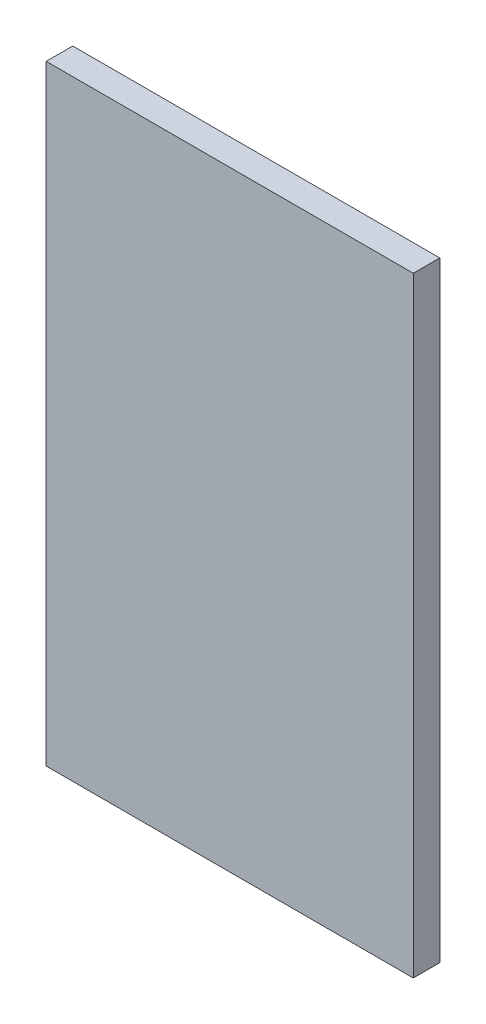
ISO-10303-21;
HEADER;
FILE_DESCRIPTION(('STEP AP214'),'2;1');
FILE_NAME('part.step','',(''),(''),'','','');
FILE_SCHEMA(('AUTOMOTIVE_DESIGN { 1 0 10303 214 1 1 1 1 }'));
ENDSEC;
DATA;
#1=APPLICATION_CONTEXT('core data for automotive mechanical design processes');
#2=APPLICATION_PROTOCOL_DEFINITION('international standard','automotive_design',2000,#1);
#3=PRODUCT_CONTEXT('',#1,'mechanical');
#4=PRODUCT('Part','Part','',(#3));
#5=PRODUCT_RELATED_PRODUCT_CATEGORY('part','',(#4));
#6=PRODUCT_DEFINITION_FORMATION('','',#4);
#7=PRODUCT_DEFINITION_CONTEXT('part definition',#1,'design');
#8=PRODUCT_DEFINITION('design','',#6,#7);
#9=PRODUCT_DEFINITION_SHAPE('','',#8);
#10=(LENGTH_UNIT() NAMED_UNIT(*) SI_UNIT(.MILLI.,.METRE.));
#11=(NAMED_UNIT(*) PLANE_ANGLE_UNIT() SI_UNIT($,.RADIAN.));
#12=(NAMED_UNIT(*) SI_UNIT($,.STERADIAN.) SOLID_ANGLE_UNIT());
#13=UNCERTAINTY_MEASURE_WITH_UNIT(LENGTH_MEASURE(1.E-05),#10,'distance_accuracy_value','');
#14=(GEOMETRIC_REPRESENTATION_CONTEXT(3) GLOBAL_UNCERTAINTY_ASSIGNED_CONTEXT((#13)) GLOBAL_UNIT_ASSIGNED_CONTEXT((#10,
#11,#12)) REPRESENTATION_CONTEXT('',''));
#15=CARTESIAN_POINT('',(0.,0.,0.));
#16=DIRECTION('',(0.,0.,1.));
#17=DIRECTION('',(1.,0.,0.));
#18=AXIS2_PLACEMENT_3D('',#15,#16,#17);
#19=CARTESIAN_POINT('',(583.,206.,12.));
#20=DIRECTION('',(-1.,0.,0.));
#21=DIRECTION('',(0.,-1.,0.));
#22=AXIS2_PLACEMENT_3D('',#19,#20,#21);
#23=PLANE('',#22);
#24=DIRECTION('',(0.,1.,0.));
#25=VECTOR('',#24,1.);
#26=CARTESIAN_POINT('',(583.,206.,0.));
#27=LINE('',#26,#25);
#28=CARTESIAN_POINT('',(583.,-70.,0.));
#29=VERTEX_POINT('',#28);
#30=CARTESIAN_POINT('',(583.,206.,0.));
#31=VERTEX_POINT('',#30);
#32=EDGE_CURVE('E95',#29,#31,#27,.T.);
#33=ORIENTED_EDGE('',*,*,#32,.T.);
#34=DIRECTION('',(0.,0.,-1.));
#35=VECTOR('',#34,1.);
#36=CARTESIAN_POINT('',(583.,206.,12.));
#37=LINE('',#36,#35);
#38=CARTESIAN_POINT('',(583.,206.,12.));
#39=VERTEX_POINT('',#38);
#40=EDGE_CURVE('E11',#39,#31,#37,.T.);
#41=ORIENTED_EDGE('',*,*,#40,.F.);
#42=DIRECTION('',(0.,1.,0.));
#43=VECTOR('',#42,1.);
#44=CARTESIAN_POINT('',(583.,206.,12.));
#45=LINE('',#44,#43);
#46=CARTESIAN_POINT('',(583.,-70.,12.));
#47=VERTEX_POINT('',#46);
#48=EDGE_CURVE('E83',#47,#39,#45,.T.);
#49=ORIENTED_EDGE('',*,*,#48,.F.);
#50=DIRECTION('',(0.,0.,-1.));
#51=VECTOR('',#50,1.);
#52=CARTESIAN_POINT('',(583.,-70.,12.));
#53=LINE('',#52,#51);
#54=EDGE_CURVE('E91',#47,#29,#53,.T.);
#55=ORIENTED_EDGE('',*,*,#54,.T.);
#56=EDGE_LOOP('',(#33,#41,#49,#55));
#57=FACE_BOUND('',#56,.T.);
#58=ADVANCED_FACE('F32',(#57),#23,.F.);
#59=CARTESIAN_POINT('',(417.,206.,12.));
#60=DIRECTION('',(0.,-1.,0.));
#61=DIRECTION('',(0.,0.,-1.));
#62=AXIS2_PLACEMENT_3D('',#59,#60,#61);
#63=PLANE('',#62);
#64=DIRECTION('',(-1.,0.,0.));
#65=VECTOR('',#64,1.);
#66=CARTESIAN_POINT('',(417.,206.,0.));
#67=LINE('',#66,#65);
#68=CARTESIAN_POINT('',(417.,206.,0.));
#69=VERTEX_POINT('',#68);
#70=EDGE_CURVE('E87',#31,#69,#67,.T.);
#71=ORIENTED_EDGE('',*,*,#70,.T.);
#72=DIRECTION('',(0.,0.,-1.));
#73=VECTOR('',#72,1.);
#74=CARTESIAN_POINT('',(417.,206.,12.));
#75=LINE('',#74,#73);
#76=CARTESIAN_POINT('',(417.,206.,12.));
#77=VERTEX_POINT('',#76);
#78=EDGE_CURVE('E40',#77,#69,#75,.T.);
#79=ORIENTED_EDGE('',*,*,#78,.F.);
#80=DIRECTION('',(-1.,0.,0.));
#81=VECTOR('',#80,1.);
#82=CARTESIAN_POINT('',(417.,206.,12.));
#83=LINE('',#82,#81);
#84=EDGE_CURVE('E78',#39,#77,#83,.T.);
#85=ORIENTED_EDGE('',*,*,#84,.F.);
#86=ORIENTED_EDGE('',*,*,#40,.T.);
#87=EDGE_LOOP('',(#71,#79,#85,#86));
#88=FACE_BOUND('',#87,.T.);
#89=ADVANCED_FACE('F86',(#88),#63,.F.);
#90=CARTESIAN_POINT('',(417.,206.,12.));
#91=DIRECTION('',(1.,0.,0.));
#92=DIRECTION('',(0.,1.,0.));
#93=AXIS2_PLACEMENT_3D('',#90,#91,#92);
#94=PLANE('',#93);
#95=DIRECTION('',(0.,-1.,0.));
#96=VECTOR('',#95,1.);
#97=CARTESIAN_POINT('',(417.,206.,0.));
#98=LINE('',#97,#96);
#99=CARTESIAN_POINT('',(417.,-70.,0.));
#100=VERTEX_POINT('',#99);
#101=EDGE_CURVE('E65',#69,#100,#98,.T.);
#102=ORIENTED_EDGE('',*,*,#101,.T.);
#103=DIRECTION('',(0.,0.,-1.));
#104=VECTOR('',#103,1.);
#105=CARTESIAN_POINT('',(417.,-70.,12.));
#106=LINE('',#105,#104);
#107=CARTESIAN_POINT('',(417.,-70.,12.));
#108=VERTEX_POINT('',#107);
#109=EDGE_CURVE('E88',#108,#100,#106,.T.);
#110=ORIENTED_EDGE('',*,*,#109,.F.);
#111=DIRECTION('',(0.,-1.,0.));
#112=VECTOR('',#111,1.);
#113=CARTESIAN_POINT('',(417.,206.,12.));
#114=LINE('',#113,#112);
#115=EDGE_CURVE('E81',#77,#108,#114,.T.);
#116=ORIENTED_EDGE('',*,*,#115,.F.);
#117=ORIENTED_EDGE('',*,*,#78,.T.);
#118=EDGE_LOOP('',(#102,#110,#116,#117));
#119=FACE_BOUND('',#118,.T.);
#120=ADVANCED_FACE('F89',(#119),#94,.F.);
#121=CARTESIAN_POINT('',(417.,-70.,12.));
#122=DIRECTION('',(0.,1.,0.));
#123=DIRECTION('',(0.,0.,1.));
#124=AXIS2_PLACEMENT_3D('',#121,#122,#123);
#125=PLANE('',#124);
#126=DIRECTION('',(1.,0.,0.));
#127=VECTOR('',#126,1.);
#128=CARTESIAN_POINT('',(417.,-70.,0.));
#129=LINE('',#128,#127);
#130=EDGE_CURVE('E71',#100,#29,#129,.T.);
#131=ORIENTED_EDGE('',*,*,#130,.T.);
#132=ORIENTED_EDGE('',*,*,#54,.F.);
#133=DIRECTION('',(1.,0.,0.));
#134=VECTOR('',#133,1.);
#135=CARTESIAN_POINT('',(417.,-70.,12.));
#136=LINE('',#135,#134);
#137=EDGE_CURVE('E48',#108,#47,#136,.T.);
#138=ORIENTED_EDGE('',*,*,#137,.F.);
#139=ORIENTED_EDGE('',*,*,#109,.T.);
#140=EDGE_LOOP('',(#131,#132,#138,#139));
#141=FACE_BOUND('',#140,.T.);
#142=ADVANCED_FACE('F102',(#141),#125,.F.);
#143=CARTESIAN_POINT('',(0.,0.,12.));
#144=DIRECTION('',(0.,0.,1.));
#145=DIRECTION('',(1.,0.,0.));
#146=AXIS2_PLACEMENT_3D('',#143,#144,#145);
#147=PLANE('',#146);
#148=ORIENTED_EDGE('',*,*,#48,.T.);
#149=ORIENTED_EDGE('',*,*,#84,.T.);
#150=ORIENTED_EDGE('',*,*,#115,.T.);
#151=ORIENTED_EDGE('',*,*,#137,.T.);
#152=EDGE_LOOP('',(#148,#149,#150,#151));
#153=FACE_BOUND('',#152,.T.);
#154=ADVANCED_FACE('F79',(#153),#147,.T.);
#155=CARTESIAN_POINT('',(0.,0.,0.));
#156=DIRECTION('',(0.,0.,1.));
#157=DIRECTION('',(1.,0.,0.));
#158=AXIS2_PLACEMENT_3D('',#155,#156,#157);
#159=PLANE('',#158);
#160=ORIENTED_EDGE('',*,*,#32,.F.);
#161=ORIENTED_EDGE('',*,*,#130,.F.);
#162=ORIENTED_EDGE('',*,*,#101,.F.);
#163=ORIENTED_EDGE('',*,*,#70,.F.);
#164=EDGE_LOOP('',(#160,#161,#162,#163));
#165=FACE_BOUND('',#164,.T.);
#166=ADVANCED_FACE('F105',(#165),#159,.F.);
#167=CLOSED_SHELL('',(#58,#89,#120,#142,#154,#166));
#168=MANIFOLD_SOLID_BREP('B2',#167);
#169=ADVANCED_BREP_SHAPE_REPRESENTATION('',(#18,#168),#14);
#170=SHAPE_DEFINITION_REPRESENTATION(#9,#169);
ENDSEC;
END-ISO-10303-21;
